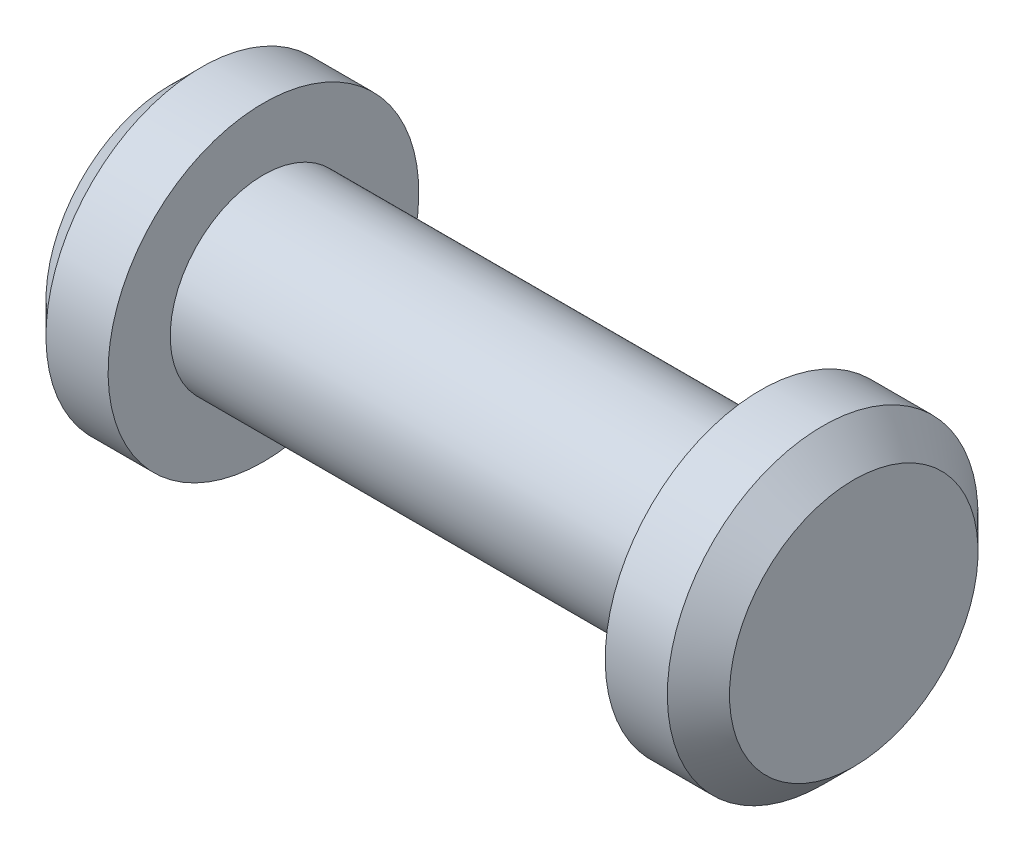
ISO-10303-21;
HEADER;
FILE_DESCRIPTION(('STEP AP214'),'2;1');
FILE_NAME('part.step','',(''),(''),'','','');
FILE_SCHEMA(('AUTOMOTIVE_DESIGN { 1 0 10303 214 1 1 1 1 }'));
ENDSEC;
DATA;
#1=APPLICATION_CONTEXT('core data for automotive mechanical design processes');
#2=APPLICATION_PROTOCOL_DEFINITION('international standard','automotive_design',2000,#1);
#3=PRODUCT_CONTEXT('',#1,'mechanical');
#4=PRODUCT('Part','Part','',(#3));
#5=PRODUCT_RELATED_PRODUCT_CATEGORY('part','',(#4));
#6=PRODUCT_DEFINITION_FORMATION('','',#4);
#7=PRODUCT_DEFINITION_CONTEXT('part definition',#1,'design');
#8=PRODUCT_DEFINITION('design','',#6,#7);
#9=PRODUCT_DEFINITION_SHAPE('','',#8);
#10=(LENGTH_UNIT() NAMED_UNIT(*) SI_UNIT(.MILLI.,.METRE.));
#11=(NAMED_UNIT(*) PLANE_ANGLE_UNIT() SI_UNIT($,.RADIAN.));
#12=(NAMED_UNIT(*) SI_UNIT($,.STERADIAN.) SOLID_ANGLE_UNIT());
#13=UNCERTAINTY_MEASURE_WITH_UNIT(LENGTH_MEASURE(1.E-05),#10,'distance_accuracy_value','');
#14=(GEOMETRIC_REPRESENTATION_CONTEXT(3) GLOBAL_UNCERTAINTY_ASSIGNED_CONTEXT((#13)) GLOBAL_UNIT_ASSIGNED_CONTEXT((#10,
#11,#12)) REPRESENTATION_CONTEXT('',''));
#15=CARTESIAN_POINT('',(0.,0.,0.));
#16=DIRECTION('',(0.,0.,1.));
#17=DIRECTION('',(1.,0.,0.));
#18=AXIS2_PLACEMENT_3D('',#15,#16,#17);
#19=CARTESIAN_POINT('',(11.,0.,0.));
#20=DIRECTION('',(1.,0.,0.));
#21=DIRECTION('',(0.,1.,0.));
#22=AXIS2_PLACEMENT_3D('',#19,#20,#21);
#23=PLANE('',#22);
#24=CARTESIAN_POINT('',(11.,0.,0.));
#25=DIRECTION('',(-1.,0.,0.));
#26=DIRECTION('',(0.,-1.,0.));
#27=AXIS2_PLACEMENT_3D('',#24,#25,#26);
#28=CIRCLE('',#27,4.);
#29=CARTESIAN_POINT('',(11.,-4.,0.));
#30=VERTEX_POINT('',#29);
#31=EDGE_CURVE('E10',#30,#30,#28,.T.);
#32=ORIENTED_EDGE('',*,*,#31,.F.);
#33=EDGE_LOOP('',(#32));
#34=FACE_BOUND('',#33,.T.);
#35=ADVANCED_FACE('F33',(#34),#23,.T.);
#36=CARTESIAN_POINT('',(10.,0.,0.));
#37=DIRECTION('',(-1.,0.,0.));
#38=DIRECTION('',(0.,-1.,0.));
#39=AXIS2_PLACEMENT_3D('',#36,#37,#38);
#40=CONICAL_SURFACE('',#39,5.,0.785398163397448);
#41=ORIENTED_EDGE('',*,*,#31,.T.);
#42=EDGE_LOOP('',(#41));
#43=FACE_BOUND('',#42,.T.);
#44=CARTESIAN_POINT('',(10.,0.,0.));
#45=DIRECTION('',(-1.,0.,0.));
#46=DIRECTION('',(0.,-1.,0.));
#47=AXIS2_PLACEMENT_3D('',#44,#45,#46);
#48=CIRCLE('',#47,5.);
#49=CARTESIAN_POINT('',(10.,-5.,0.));
#50=VERTEX_POINT('',#49);
#51=EDGE_CURVE('E39',#50,#50,#48,.T.);
#52=ORIENTED_EDGE('',*,*,#51,.F.);
#53=EDGE_LOOP('',(#52));
#54=FACE_BOUND('',#53,.T.);
#55=ADVANCED_FACE('F81',(#43,#54),#40,.T.);
#56=CARTESIAN_POINT('',(-11.,0.,0.));
#57=DIRECTION('',(-1.,0.,0.));
#58=DIRECTION('',(0.,-1.,0.));
#59=AXIS2_PLACEMENT_3D('',#56,#57,#58);
#60=CYLINDRICAL_SURFACE('',#59,5.);
#61=ORIENTED_EDGE('',*,*,#51,.T.);
#62=EDGE_LOOP('',(#61));
#63=FACE_BOUND('',#62,.T.);
#64=CARTESIAN_POINT('',(8.,0.,0.));
#65=DIRECTION('',(-1.,0.,0.));
#66=DIRECTION('',(0.,-1.,0.));
#67=AXIS2_PLACEMENT_3D('',#64,#65,#66);
#68=CIRCLE('',#67,5.);
#69=CARTESIAN_POINT('',(8.,-5.,0.));
#70=VERTEX_POINT('',#69);
#71=EDGE_CURVE('E43',#70,#70,#68,.T.);
#72=ORIENTED_EDGE('',*,*,#71,.F.);
#73=EDGE_LOOP('',(#72));
#74=FACE_BOUND('',#73,.T.);
#75=ADVANCED_FACE('F86',(#63,#74),#60,.T.);
#76=CARTESIAN_POINT('',(8.,-5.,0.));
#77=DIRECTION('',(-1.,0.,0.));
#78=DIRECTION('',(0.,-1.,0.));
#79=AXIS2_PLACEMENT_3D('',#76,#77,#78);
#80=PLANE('',#79);
#81=ORIENTED_EDGE('',*,*,#71,.T.);
#82=EDGE_LOOP('',(#81));
#83=FACE_BOUND('',#82,.T.);
#84=CARTESIAN_POINT('',(8.,0.,0.));
#85=DIRECTION('',(-1.,0.,0.));
#86=DIRECTION('',(0.,-1.,0.));
#87=AXIS2_PLACEMENT_3D('',#84,#85,#86);
#88=CIRCLE('',#87,3.);
#89=CARTESIAN_POINT('',(8.,-3.,0.));
#90=VERTEX_POINT('',#89);
#91=EDGE_CURVE('E47',#90,#90,#88,.T.);
#92=ORIENTED_EDGE('',*,*,#91,.F.);
#93=EDGE_LOOP('',(#92));
#94=FACE_BOUND('',#93,.T.);
#95=ADVANCED_FACE('F90',(#83,#94),#80,.T.);
#96=CARTESIAN_POINT('',(-11.,0.,0.));
#97=DIRECTION('',(-1.,0.,0.));
#98=DIRECTION('',(0.,-1.,0.));
#99=AXIS2_PLACEMENT_3D('',#96,#97,#98);
#100=CYLINDRICAL_SURFACE('',#99,3.);
#101=ORIENTED_EDGE('',*,*,#91,.T.);
#102=EDGE_LOOP('',(#101));
#103=FACE_BOUND('',#102,.T.);
#104=CARTESIAN_POINT('',(-8.,0.,0.));
#105=DIRECTION('',(-1.,0.,0.));
#106=DIRECTION('',(0.,-1.,0.));
#107=AXIS2_PLACEMENT_3D('',#104,#105,#106);
#108=CIRCLE('',#107,3.);
#109=CARTESIAN_POINT('',(-8.,-3.,0.));
#110=VERTEX_POINT('',#109);
#111=EDGE_CURVE('E52',#110,#110,#108,.T.);
#112=ORIENTED_EDGE('',*,*,#111,.F.);
#113=EDGE_LOOP('',(#112));
#114=FACE_BOUND('',#113,.T.);
#115=ADVANCED_FACE('F96',(#103,#114),#100,.T.);
#116=CARTESIAN_POINT('',(-8.,-5.,0.));
#117=DIRECTION('',(1.,0.,0.));
#118=DIRECTION('',(0.,1.,0.));
#119=AXIS2_PLACEMENT_3D('',#116,#117,#118);
#120=PLANE('',#119);
#121=ORIENTED_EDGE('',*,*,#111,.T.);
#122=EDGE_LOOP('',(#121));
#123=FACE_BOUND('',#122,.T.);
#124=CARTESIAN_POINT('',(-8.,0.,0.));
#125=DIRECTION('',(-1.,0.,0.));
#126=DIRECTION('',(0.,-1.,0.));
#127=AXIS2_PLACEMENT_3D('',#124,#125,#126);
#128=CIRCLE('',#127,5.);
#129=CARTESIAN_POINT('',(-8.,-5.,0.));
#130=VERTEX_POINT('',#129);
#131=EDGE_CURVE('E55',#130,#130,#128,.T.);
#132=ORIENTED_EDGE('',*,*,#131,.F.);
#133=EDGE_LOOP('',(#132));
#134=FACE_BOUND('',#133,.T.);
#135=ADVANCED_FACE('F77',(#123,#134),#120,.T.);
#136=CARTESIAN_POINT('',(-11.,0.,0.));
#137=DIRECTION('',(-1.,0.,0.));
#138=DIRECTION('',(0.,-1.,0.));
#139=AXIS2_PLACEMENT_3D('',#136,#137,#138);
#140=CYLINDRICAL_SURFACE('',#139,5.);
#141=ORIENTED_EDGE('',*,*,#131,.T.);
#142=EDGE_LOOP('',(#141));
#143=FACE_BOUND('',#142,.T.);
#144=CARTESIAN_POINT('',(-10.,0.,0.));
#145=DIRECTION('',(-1.,0.,0.));
#146=DIRECTION('',(0.,-1.,0.));
#147=AXIS2_PLACEMENT_3D('',#144,#145,#146);
#148=CIRCLE('',#147,5.);
#149=CARTESIAN_POINT('',(-10.,-5.,0.));
#150=VERTEX_POINT('',#149);
#151=EDGE_CURVE('E58',#150,#150,#148,.T.);
#152=ORIENTED_EDGE('',*,*,#151,.F.);
#153=EDGE_LOOP('',(#152));
#154=FACE_BOUND('',#153,.T.);
#155=ADVANCED_FACE('F69',(#143,#154),#140,.T.);
#156=CARTESIAN_POINT('',(-11.,0.,0.));
#157=DIRECTION('',(1.,0.,0.));
#158=DIRECTION('',(0.,1.,0.));
#159=AXIS2_PLACEMENT_3D('',#156,#157,#158);
#160=CONICAL_SURFACE('',#159,4.,0.785398163397449);
#161=ORIENTED_EDGE('',*,*,#151,.T.);
#162=EDGE_LOOP('',(#161));
#163=FACE_BOUND('',#162,.T.);
#164=CARTESIAN_POINT('',(-11.,0.,0.));
#165=DIRECTION('',(-1.,0.,0.));
#166=DIRECTION('',(0.,-1.,0.));
#167=AXIS2_PLACEMENT_3D('',#164,#165,#166);
#168=CIRCLE('',#167,4.);
#169=CARTESIAN_POINT('',(-11.,-4.,0.));
#170=VERTEX_POINT('',#169);
#171=EDGE_CURVE('E61',#170,#170,#168,.T.);
#172=ORIENTED_EDGE('',*,*,#171,.F.);
#173=EDGE_LOOP('',(#172));
#174=FACE_BOUND('',#173,.T.);
#175=ADVANCED_FACE('F67',(#163,#174),#160,.T.);
#176=CARTESIAN_POINT('',(-11.,0.,0.));
#177=DIRECTION('',(-1.,0.,0.));
#178=DIRECTION('',(0.,-1.,0.));
#179=AXIS2_PLACEMENT_3D('',#176,#177,#178);
#180=PLANE('',#179);
#181=ORIENTED_EDGE('',*,*,#171,.T.);
#182=EDGE_LOOP('',(#181));
#183=FACE_BOUND('',#182,.T.);
#184=ADVANCED_FACE('F65',(#183),#180,.T.);
#185=CLOSED_SHELL('',(#35,#55,#75,#95,#115,#135,#155,#175,#184));
#186=MANIFOLD_SOLID_BREP('B2',#185);
#187=ADVANCED_BREP_SHAPE_REPRESENTATION('',(#18,#186),#14);
#188=SHAPE_DEFINITION_REPRESENTATION(#9,#187);
ENDSEC;
END-ISO-10303-21;
